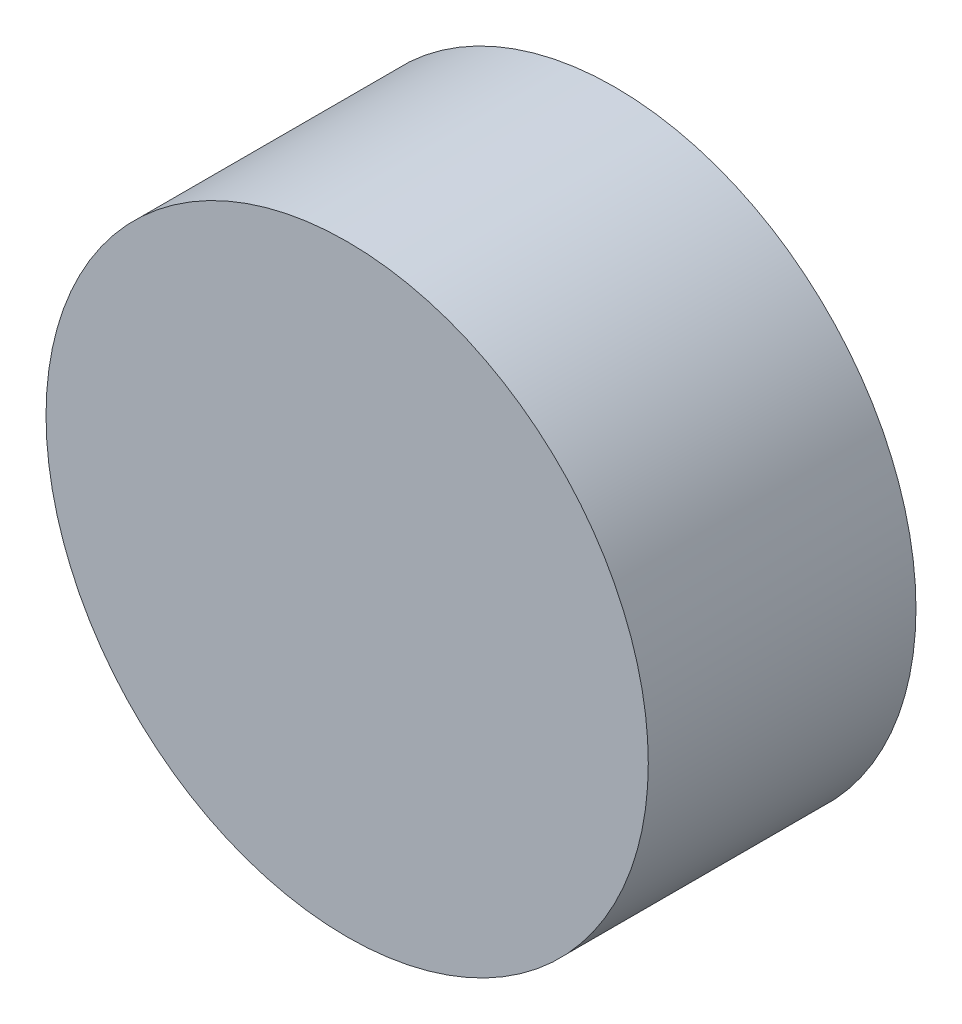
ISO-10303-21;
HEADER;
FILE_DESCRIPTION(('STEP AP214'),'2;1');
FILE_NAME('part.step','',(''),(''),'','','');
FILE_SCHEMA(('AUTOMOTIVE_DESIGN { 1 0 10303 214 1 1 1 1 }'));
ENDSEC;
DATA;
#1=APPLICATION_CONTEXT('core data for automotive mechanical design processes');
#2=APPLICATION_PROTOCOL_DEFINITION('international standard','automotive_design',2000,#1);
#3=PRODUCT_CONTEXT('',#1,'mechanical');
#4=PRODUCT('Part','Part','',(#3));
#5=PRODUCT_RELATED_PRODUCT_CATEGORY('part','',(#4));
#6=PRODUCT_DEFINITION_FORMATION('','',#4);
#7=PRODUCT_DEFINITION_CONTEXT('part definition',#1,'design');
#8=PRODUCT_DEFINITION('design','',#6,#7);
#9=PRODUCT_DEFINITION_SHAPE('','',#8);
#10=(LENGTH_UNIT() NAMED_UNIT(*) SI_UNIT(.MILLI.,.METRE.));
#11=(NAMED_UNIT(*) PLANE_ANGLE_UNIT() SI_UNIT($,.RADIAN.));
#12=(NAMED_UNIT(*) SI_UNIT($,.STERADIAN.) SOLID_ANGLE_UNIT());
#13=UNCERTAINTY_MEASURE_WITH_UNIT(LENGTH_MEASURE(1.E-05),#10,'distance_accuracy_value','');
#14=(GEOMETRIC_REPRESENTATION_CONTEXT(3) GLOBAL_UNCERTAINTY_ASSIGNED_CONTEXT((#13)) GLOBAL_UNIT_ASSIGNED_CONTEXT((#10,
#11,#12)) REPRESENTATION_CONTEXT('',''));
#15=CARTESIAN_POINT('',(0.,0.,0.));
#16=DIRECTION('',(0.,0.,1.));
#17=DIRECTION('',(1.,0.,0.));
#18=AXIS2_PLACEMENT_3D('',#15,#16,#17);
#19=CARTESIAN_POINT('',(0.,0.,40.));
#20=DIRECTION('',(0.,0.,-1.));
#21=DIRECTION('',(-1.,0.,0.));
#22=AXIS2_PLACEMENT_3D('',#19,#20,#21);
#23=CYLINDRICAL_SURFACE('',#22,45.);
#24=CARTESIAN_POINT('',(0.,0.,40.));
#25=DIRECTION('',(0.,0.,1.));
#26=DIRECTION('',(1.,0.,0.));
#27=AXIS2_PLACEMENT_3D('',#24,#25,#26);
#28=CIRCLE('',#27,45.);
#29=CARTESIAN_POINT('',(45.,0.,40.));
#30=VERTEX_POINT('',#29);
#31=EDGE_CURVE('E10',#30,#30,#28,.T.);
#32=ORIENTED_EDGE('',*,*,#31,.F.);
#33=EDGE_LOOP('',(#32));
#34=FACE_BOUND('',#33,.T.);
#35=CARTESIAN_POINT('',(0.,0.,0.));
#36=DIRECTION('',(0.,0.,1.));
#37=DIRECTION('',(1.,0.,0.));
#38=AXIS2_PLACEMENT_3D('',#35,#36,#37);
#39=CIRCLE('',#38,45.);
#40=CARTESIAN_POINT('',(45.,0.,0.));
#41=VERTEX_POINT('',#40);
#42=EDGE_CURVE('E37',#41,#41,#39,.T.);
#43=ORIENTED_EDGE('',*,*,#42,.T.);
#44=EDGE_LOOP('',(#43));
#45=FACE_BOUND('',#44,.T.);
#46=ADVANCED_FACE('F40',(#34,#45),#23,.T.);
#47=CARTESIAN_POINT('',(0.,0.,40.));
#48=DIRECTION('',(0.,0.,1.));
#49=DIRECTION('',(1.,0.,0.));
#50=AXIS2_PLACEMENT_3D('',#47,#48,#49);
#51=PLANE('',#50);
#52=ORIENTED_EDGE('',*,*,#31,.T.);
#53=EDGE_LOOP('',(#52));
#54=FACE_BOUND('',#53,.T.);
#55=ADVANCED_FACE('F55',(#54),#51,.T.);
#56=CARTESIAN_POINT('',(0.,0.,0.));
#57=DIRECTION('',(0.,0.,1.));
#58=DIRECTION('',(1.,0.,0.));
#59=AXIS2_PLACEMENT_3D('',#56,#57,#58);
#60=PLANE('',#59);
#61=ORIENTED_EDGE('',*,*,#42,.F.);
#62=EDGE_LOOP('',(#61));
#63=FACE_BOUND('',#62,.T.);
#64=ADVANCED_FACE('F49',(#63),#60,.F.);
#65=CLOSED_SHELL('',(#46,#55,#64));
#66=MANIFOLD_SOLID_BREP('B2',#65);
#67=ADVANCED_BREP_SHAPE_REPRESENTATION('',(#18,#66),#14);
#68=SHAPE_DEFINITION_REPRESENTATION(#9,#67);
ENDSEC;
END-ISO-10303-21;
